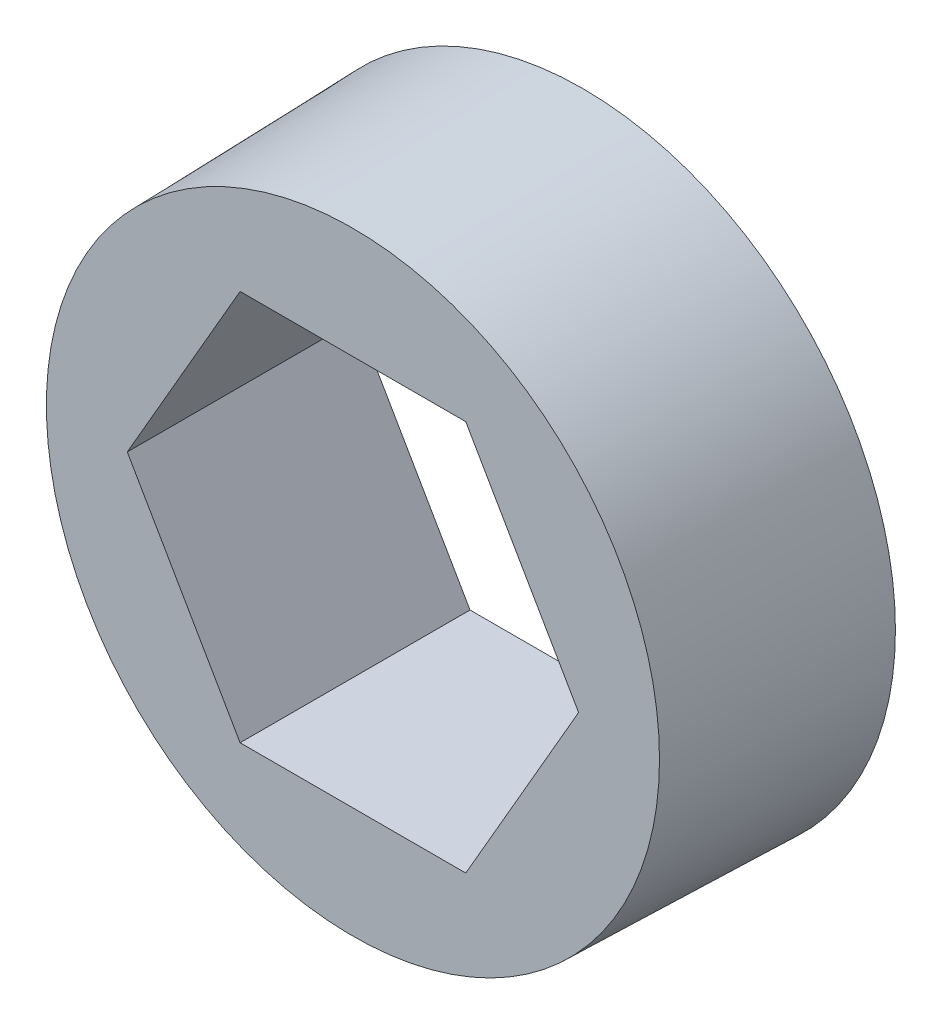
ISO-10303-21;
HEADER;
FILE_DESCRIPTION(('STEP AP214'),'2;1');
FILE_NAME('part.step','',(''),(''),'','','');
FILE_SCHEMA(('AUTOMOTIVE_DESIGN { 1 0 10303 214 1 1 1 1 }'));
ENDSEC;
DATA;
#1=APPLICATION_CONTEXT('core data for automotive mechanical design processes');
#2=APPLICATION_PROTOCOL_DEFINITION('international standard','automotive_design',2000,#1);
#3=PRODUCT_CONTEXT('',#1,'mechanical');
#4=PRODUCT('Part','Part','',(#3));
#5=PRODUCT_RELATED_PRODUCT_CATEGORY('part','',(#4));
#6=PRODUCT_DEFINITION_FORMATION('','',#4);
#7=PRODUCT_DEFINITION_CONTEXT('part definition',#1,'design');
#8=PRODUCT_DEFINITION('design','',#6,#7);
#9=PRODUCT_DEFINITION_SHAPE('','',#8);
#10=(LENGTH_UNIT() NAMED_UNIT(*) SI_UNIT(.MILLI.,.METRE.));
#11=(NAMED_UNIT(*) PLANE_ANGLE_UNIT() SI_UNIT($,.RADIAN.));
#12=(NAMED_UNIT(*) SI_UNIT($,.STERADIAN.) SOLID_ANGLE_UNIT());
#13=UNCERTAINTY_MEASURE_WITH_UNIT(LENGTH_MEASURE(1.E-05),#10,'distance_accuracy_value','');
#14=(GEOMETRIC_REPRESENTATION_CONTEXT(3) GLOBAL_UNCERTAINTY_ASSIGNED_CONTEXT((#13)) GLOBAL_UNIT_ASSIGNED_CONTEXT((#10,
#11,#12)) REPRESENTATION_CONTEXT('',''));
#15=CARTESIAN_POINT('',(0.,0.,0.));
#16=DIRECTION('',(0.,0.,1.));
#17=DIRECTION('',(1.,0.,0.));
#18=AXIS2_PLACEMENT_3D('',#15,#16,#17);
#19=CARTESIAN_POINT('',(0.,0.,1.5));
#20=DIRECTION('',(0.,0.,-1.));
#21=DIRECTION('',(-1.,0.,0.));
#22=AXIS2_PLACEMENT_3D('',#19,#20,#21);
#23=CONICAL_SURFACE('',#22,3.99999999999778,0.0261799387509188);
#24=CARTESIAN_POINT('',(0.,0.,-1.5));
#25=DIRECTION('',(0.,0.,1.));
#26=DIRECTION('',(1.,0.,0.));
#27=AXIS2_PLACEMENT_3D('',#24,#25,#26);
#28=CIRCLE('',#27,4.0785577646183);
#29=CARTESIAN_POINT('',(4.0785577646183,0.,-1.5));
#30=VERTEX_POINT('',#29);
#31=EDGE_CURVE('E11',#30,#30,#28,.T.);
#32=ORIENTED_EDGE('',*,*,#31,.T.);
#33=EDGE_LOOP('',(#32));
#34=FACE_BOUND('',#33,.T.);
#35=CARTESIAN_POINT('',(0.,0.,1.5));
#36=DIRECTION('',(0.,0.,1.));
#37=DIRECTION('',(1.,0.,0.));
#38=AXIS2_PLACEMENT_3D('',#35,#36,#37);
#39=CIRCLE('',#38,3.99999999999778);
#40=CARTESIAN_POINT('',(3.99999999999778,0.,1.5));
#41=VERTEX_POINT('',#40);
#42=EDGE_CURVE('E40',#41,#41,#39,.T.);
#43=ORIENTED_EDGE('',*,*,#42,.F.);
#44=EDGE_LOOP('',(#43));
#45=FACE_BOUND('',#44,.T.);
#46=ADVANCED_FACE('F33',(#34,#45),#23,.T.);
#47=CARTESIAN_POINT('',(4.0785577646183,0.,-1.5));
#48=DIRECTION('',(0.,0.,-1.));
#49=DIRECTION('',(-1.,0.,0.));
#50=AXIS2_PLACEMENT_3D('',#47,#48,#49);
#51=PLANE('',#50);
#52=DIRECTION('',(0.5,-0.866025403784439,0.));
#53=VECTOR('',#52,1.);
#54=CARTESIAN_POINT('',(1.47224318643355,2.55,-1.5));
#55=LINE('',#54,#53);
#56=CARTESIAN_POINT('',(1.47224318643355,2.55,-1.5));
#57=VERTEX_POINT('',#56);
#58=CARTESIAN_POINT('',(2.94448637286709,0.,-1.5));
#59=VERTEX_POINT('',#58);
#60=EDGE_CURVE('E47',#57,#59,#55,.T.);
#61=ORIENTED_EDGE('',*,*,#60,.F.);
#62=DIRECTION('',(1.,0.,0.));
#63=VECTOR('',#62,1.);
#64=CARTESIAN_POINT('',(-1.47224318643355,2.55,-1.5));
#65=LINE('',#64,#63);
#66=CARTESIAN_POINT('',(-1.47224318643355,2.55,-1.5));
#67=VERTEX_POINT('',#66);
#68=EDGE_CURVE('E104',#67,#57,#65,.T.);
#69=ORIENTED_EDGE('',*,*,#68,.F.);
#70=DIRECTION('',(0.5,0.866025403784439,0.));
#71=VECTOR('',#70,1.);
#72=CARTESIAN_POINT('',(-2.94448637286709,0.,-1.5));
#73=LINE('',#72,#71);
#74=CARTESIAN_POINT('',(-2.94448637286709,0.,-1.5));
#75=VERTEX_POINT('',#74);
#76=EDGE_CURVE('E107',#75,#67,#73,.T.);
#77=ORIENTED_EDGE('',*,*,#76,.F.);
#78=DIRECTION('',(-0.5,0.866025403784439,0.));
#79=VECTOR('',#78,1.);
#80=CARTESIAN_POINT('',(-1.47224318643355,-2.55,-1.5));
#81=LINE('',#80,#79);
#82=CARTESIAN_POINT('',(-1.47224318643355,-2.55,-1.5));
#83=VERTEX_POINT('',#82);
#84=EDGE_CURVE('E123',#83,#75,#81,.T.);
#85=ORIENTED_EDGE('',*,*,#84,.F.);
#86=DIRECTION('',(-1.,0.,0.));
#87=VECTOR('',#86,1.);
#88=CARTESIAN_POINT('',(1.47224318643355,-2.55,-1.5));
#89=LINE('',#88,#87);
#90=CARTESIAN_POINT('',(1.47224318643355,-2.55,-1.5));
#91=VERTEX_POINT('',#90);
#92=EDGE_CURVE('E120',#91,#83,#89,.T.);
#93=ORIENTED_EDGE('',*,*,#92,.F.);
#94=DIRECTION('',(-0.5,-0.866025403784439,0.));
#95=VECTOR('',#94,1.);
#96=CARTESIAN_POINT('',(2.94448637286709,0.,-1.5));
#97=LINE('',#96,#95);
#98=EDGE_CURVE('E118',#59,#91,#97,.T.);
#99=ORIENTED_EDGE('',*,*,#98,.F.);
#100=EDGE_LOOP('',(#61,#69,#77,#85,#93,#99));
#101=FACE_BOUND('',#100,.T.);
#102=ORIENTED_EDGE('',*,*,#31,.F.);
#103=EDGE_LOOP('',(#102));
#104=FACE_BOUND('',#103,.T.);
#105=ADVANCED_FACE('F140',(#101,#104),#51,.T.);
#106=CARTESIAN_POINT('',(0.,0.,1.5));
#107=DIRECTION('',(0.,0.,1.));
#108=DIRECTION('',(1.,0.,0.));
#109=AXIS2_PLACEMENT_3D('',#106,#107,#108);
#110=PLANE('',#109);
#111=DIRECTION('',(0.5,-0.866025403784439,0.));
#112=VECTOR('',#111,1.);
#113=CARTESIAN_POINT('',(1.47224318643355,2.55,1.5));
#114=LINE('',#113,#112);
#115=CARTESIAN_POINT('',(1.47224318643355,2.55,1.5));
#116=VERTEX_POINT('',#115);
#117=CARTESIAN_POINT('',(2.94448637286709,0.,1.5));
#118=VERTEX_POINT('',#117);
#119=EDGE_CURVE('E87',#116,#118,#114,.T.);
#120=ORIENTED_EDGE('',*,*,#119,.T.);
#121=DIRECTION('',(-0.5,-0.866025403784439,0.));
#122=VECTOR('',#121,1.);
#123=CARTESIAN_POINT('',(2.94448637286709,0.,1.5));
#124=LINE('',#123,#122);
#125=CARTESIAN_POINT('',(1.47224318643355,-2.55,1.5));
#126=VERTEX_POINT('',#125);
#127=EDGE_CURVE('E96',#118,#126,#124,.T.);
#128=ORIENTED_EDGE('',*,*,#127,.T.);
#129=DIRECTION('',(-1.,0.,0.));
#130=VECTOR('',#129,1.);
#131=CARTESIAN_POINT('',(1.47224318643355,-2.55,1.5));
#132=LINE('',#131,#130);
#133=CARTESIAN_POINT('',(-1.47224318643355,-2.55,1.5));
#134=VERTEX_POINT('',#133);
#135=EDGE_CURVE('E55',#126,#134,#132,.T.);
#136=ORIENTED_EDGE('',*,*,#135,.T.);
#137=DIRECTION('',(-0.5,0.866025403784439,0.));
#138=VECTOR('',#137,1.);
#139=CARTESIAN_POINT('',(-1.47224318643355,-2.55,1.5));
#140=LINE('',#139,#138);
#141=CARTESIAN_POINT('',(-2.94448637286709,0.,1.5));
#142=VERTEX_POINT('',#141);
#143=EDGE_CURVE('E111',#134,#142,#140,.T.);
#144=ORIENTED_EDGE('',*,*,#143,.T.);
#145=DIRECTION('',(0.5,0.866025403784439,0.));
#146=VECTOR('',#145,1.);
#147=CARTESIAN_POINT('',(-2.94448637286709,0.,1.5));
#148=LINE('',#147,#146);
#149=CARTESIAN_POINT('',(-1.47224318643355,2.55,1.5));
#150=VERTEX_POINT('',#149);
#151=EDGE_CURVE('E114',#142,#150,#148,.T.);
#152=ORIENTED_EDGE('',*,*,#151,.T.);
#153=DIRECTION('',(1.,0.,0.));
#154=VECTOR('',#153,1.);
#155=CARTESIAN_POINT('',(-1.47224318643355,2.55,1.5));
#156=LINE('',#155,#154);
#157=EDGE_CURVE('E93',#150,#116,#156,.T.);
#158=ORIENTED_EDGE('',*,*,#157,.T.);
#159=EDGE_LOOP('',(#120,#128,#136,#144,#152,#158));
#160=FACE_BOUND('',#159,.T.);
#161=ORIENTED_EDGE('',*,*,#42,.T.);
#162=EDGE_LOOP('',(#161));
#163=FACE_BOUND('',#162,.T.);
#164=ADVANCED_FACE('F100',(#160,#163),#110,.T.);
#165=CARTESIAN_POINT('',(1.47224318643355,2.55,1.5));
#166=DIRECTION('',(0.866025403784439,0.5,0.));
#167=DIRECTION('',(-0.5,0.866025403784439,0.));
#168=AXIS2_PLACEMENT_3D('',#165,#166,#167);
#169=PLANE('',#168);
#170=ORIENTED_EDGE('',*,*,#60,.T.);
#171=DIRECTION('',(0.,0.,-1.));
#172=VECTOR('',#171,1.);
#173=CARTESIAN_POINT('',(2.94448637286709,0.,1.5));
#174=LINE('',#173,#172);
#175=EDGE_CURVE('E83',#118,#59,#174,.T.);
#176=ORIENTED_EDGE('',*,*,#175,.F.);
#177=ORIENTED_EDGE('',*,*,#119,.F.);
#178=DIRECTION('',(0.,0.,-1.));
#179=VECTOR('',#178,1.);
#180=CARTESIAN_POINT('',(1.47224318643355,2.55,1.5));
#181=LINE('',#180,#179);
#182=EDGE_CURVE('E128',#116,#57,#181,.T.);
#183=ORIENTED_EDGE('',*,*,#182,.T.);
#184=EDGE_LOOP('',(#170,#176,#177,#183));
#185=FACE_BOUND('',#184,.T.);
#186=ADVANCED_FACE('F85',(#185),#169,.F.);
#187=CARTESIAN_POINT('',(-1.47224318643355,2.55,1.5));
#188=DIRECTION('',(0.,1.,0.));
#189=DIRECTION('',(-1.,0.,0.));
#190=AXIS2_PLACEMENT_3D('',#187,#188,#189);
#191=PLANE('',#190);
#192=ORIENTED_EDGE('',*,*,#68,.T.);
#193=ORIENTED_EDGE('',*,*,#182,.F.);
#194=ORIENTED_EDGE('',*,*,#157,.F.);
#195=DIRECTION('',(0.,0.,-1.));
#196=VECTOR('',#195,1.);
#197=CARTESIAN_POINT('',(-1.47224318643355,2.55,1.5));
#198=LINE('',#197,#196);
#199=EDGE_CURVE('E130',#150,#67,#198,.T.);
#200=ORIENTED_EDGE('',*,*,#199,.T.);
#201=EDGE_LOOP('',(#192,#193,#194,#200));
#202=FACE_BOUND('',#201,.T.);
#203=ADVANCED_FACE('F155',(#202),#191,.F.);
#204=CARTESIAN_POINT('',(-2.94448637286709,0.,1.5));
#205=DIRECTION('',(-0.866025403784439,0.5,0.));
#206=DIRECTION('',(-0.5,-0.866025403784439,0.));
#207=AXIS2_PLACEMENT_3D('',#204,#205,#206);
#208=PLANE('',#207);
#209=ORIENTED_EDGE('',*,*,#76,.T.);
#210=ORIENTED_EDGE('',*,*,#199,.F.);
#211=ORIENTED_EDGE('',*,*,#151,.F.);
#212=DIRECTION('',(0.,0.,-1.));
#213=VECTOR('',#212,1.);
#214=CARTESIAN_POINT('',(-2.94448637286709,0.,1.5));
#215=LINE('',#214,#213);
#216=EDGE_CURVE('E132',#142,#75,#215,.T.);
#217=ORIENTED_EDGE('',*,*,#216,.T.);
#218=EDGE_LOOP('',(#209,#210,#211,#217));
#219=FACE_BOUND('',#218,.T.);
#220=ADVANCED_FACE('F164',(#219),#208,.F.);
#221=CARTESIAN_POINT('',(-1.47224318643355,-2.55,1.5));
#222=DIRECTION('',(-0.866025403784439,-0.5,0.));
#223=DIRECTION('',(0.5,-0.866025403784439,0.));
#224=AXIS2_PLACEMENT_3D('',#221,#222,#223);
#225=PLANE('',#224);
#226=ORIENTED_EDGE('',*,*,#84,.T.);
#227=ORIENTED_EDGE('',*,*,#216,.F.);
#228=ORIENTED_EDGE('',*,*,#143,.F.);
#229=DIRECTION('',(0.,0.,-1.));
#230=VECTOR('',#229,1.);
#231=CARTESIAN_POINT('',(-1.47224318643355,-2.55,1.5));
#232=LINE('',#231,#230);
#233=EDGE_CURVE('E134',#134,#83,#232,.T.);
#234=ORIENTED_EDGE('',*,*,#233,.T.);
#235=EDGE_LOOP('',(#226,#227,#228,#234));
#236=FACE_BOUND('',#235,.T.);
#237=ADVANCED_FACE('F161',(#236),#225,.F.);
#238=CARTESIAN_POINT('',(1.47224318643355,-2.55,1.5));
#239=DIRECTION('',(0.,-1.,0.));
#240=DIRECTION('',(1.,0.,0.));
#241=AXIS2_PLACEMENT_3D('',#238,#239,#240);
#242=PLANE('',#241);
#243=ORIENTED_EDGE('',*,*,#92,.T.);
#244=ORIENTED_EDGE('',*,*,#233,.F.);
#245=ORIENTED_EDGE('',*,*,#135,.F.);
#246=DIRECTION('',(0.,0.,-1.));
#247=VECTOR('',#246,1.);
#248=CARTESIAN_POINT('',(1.47224318643355,-2.55,1.5));
#249=LINE('',#248,#247);
#250=EDGE_CURVE('E92',#126,#91,#249,.T.);
#251=ORIENTED_EDGE('',*,*,#250,.T.);
#252=EDGE_LOOP('',(#243,#244,#245,#251));
#253=FACE_BOUND('',#252,.T.);
#254=ADVANCED_FACE('F158',(#253),#242,.F.);
#255=CARTESIAN_POINT('',(2.94448637286709,0.,1.5));
#256=DIRECTION('',(0.866025403784439,-0.5,0.));
#257=DIRECTION('',(0.5,0.866025403784439,0.));
#258=AXIS2_PLACEMENT_3D('',#255,#256,#257);
#259=PLANE('',#258);
#260=ORIENTED_EDGE('',*,*,#98,.T.);
#261=ORIENTED_EDGE('',*,*,#250,.F.);
#262=ORIENTED_EDGE('',*,*,#127,.F.);
#263=ORIENTED_EDGE('',*,*,#175,.T.);
#264=EDGE_LOOP('',(#260,#261,#262,#263));
#265=FACE_BOUND('',#264,.T.);
#266=ADVANCED_FACE('F97',(#265),#259,.F.);
#267=CLOSED_SHELL('',(#46,#105,#164,#186,#203,#220,#237,#254,#266));
#268=MANIFOLD_SOLID_BREP('B2',#267);
#269=ADVANCED_BREP_SHAPE_REPRESENTATION('',(#18,#268),#14);
#270=SHAPE_DEFINITION_REPRESENTATION(#9,#269);
ENDSEC;
END-ISO-10303-21;
